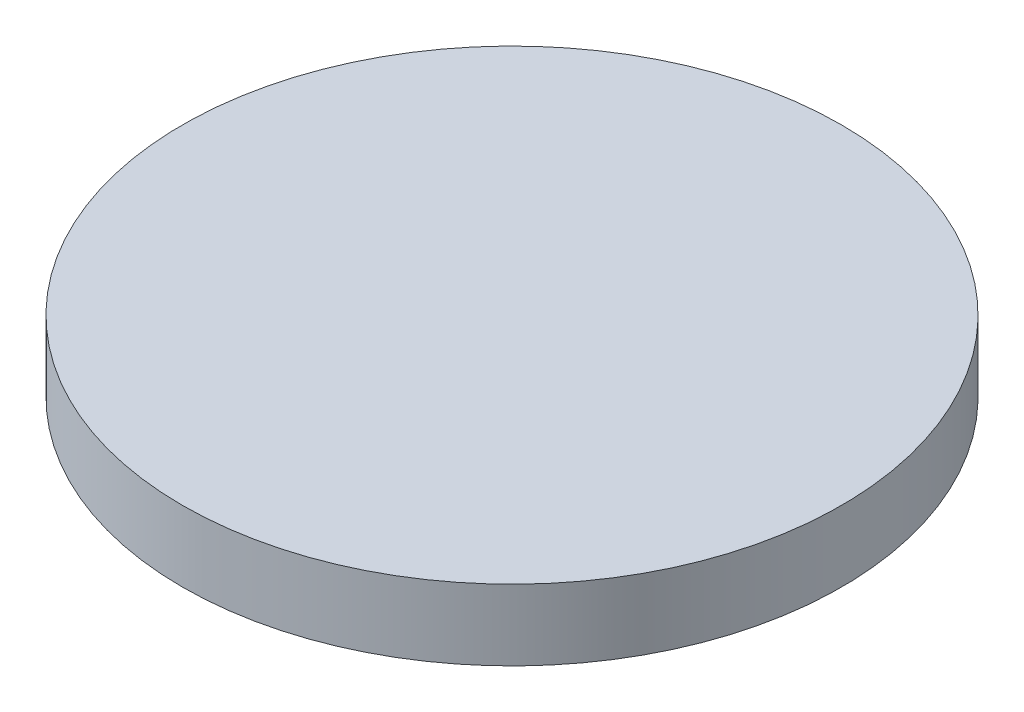
ISO-10303-21;
HEADER;
FILE_DESCRIPTION(('STEP AP214'),'2;1');
FILE_NAME('part.step','',(''),(''),'','','');
FILE_SCHEMA(('AUTOMOTIVE_DESIGN { 1 0 10303 214 1 1 1 1 }'));
ENDSEC;
DATA;
#1=APPLICATION_CONTEXT('core data for automotive mechanical design processes');
#2=APPLICATION_PROTOCOL_DEFINITION('international standard','automotive_design',2000,#1);
#3=PRODUCT_CONTEXT('',#1,'mechanical');
#4=PRODUCT('Part','Part','',(#3));
#5=PRODUCT_RELATED_PRODUCT_CATEGORY('part','',(#4));
#6=PRODUCT_DEFINITION_FORMATION('','',#4);
#7=PRODUCT_DEFINITION_CONTEXT('part definition',#1,'design');
#8=PRODUCT_DEFINITION('design','',#6,#7);
#9=PRODUCT_DEFINITION_SHAPE('','',#8);
#10=(LENGTH_UNIT() NAMED_UNIT(*) SI_UNIT(.MILLI.,.METRE.));
#11=(NAMED_UNIT(*) PLANE_ANGLE_UNIT() SI_UNIT($,.RADIAN.));
#12=(NAMED_UNIT(*) SI_UNIT($,.STERADIAN.) SOLID_ANGLE_UNIT());
#13=UNCERTAINTY_MEASURE_WITH_UNIT(LENGTH_MEASURE(1.E-05),#10,'distance_accuracy_value','');
#14=(GEOMETRIC_REPRESENTATION_CONTEXT(3) GLOBAL_UNCERTAINTY_ASSIGNED_CONTEXT((#13)) GLOBAL_UNIT_ASSIGNED_CONTEXT((#10,
#11,#12)) REPRESENTATION_CONTEXT('',''));
#15=CARTESIAN_POINT('',(0.,0.,0.));
#16=DIRECTION('',(0.,0.,1.));
#17=DIRECTION('',(1.,0.,0.));
#18=AXIS2_PLACEMENT_3D('',#15,#16,#17);
#19=CARTESIAN_POINT('',(0.,0.,0.));
#20=DIRECTION('',(0.,1.,0.));
#21=DIRECTION('',(0.,0.,1.));
#22=AXIS2_PLACEMENT_3D('',#19,#20,#21);
#23=PLANE('',#22);
#24=CARTESIAN_POINT('',(0.,0.,0.));
#25=DIRECTION('',(0.,1.,0.));
#26=DIRECTION('',(0.,0.,1.));
#27=AXIS2_PLACEMENT_3D('',#24,#25,#26);
#28=CIRCLE('',#27,41.89709041917);
#29=CARTESIAN_POINT('',(0.,0.,-41.89709041917));
#30=VERTEX_POINT('',#29);
#31=EDGE_CURVE('E10',#30,#30,#28,.T.);
#32=ORIENTED_EDGE('',*,*,#31,.F.);
#33=EDGE_LOOP('',(#32));
#34=FACE_BOUND('',#33,.T.);
#35=CARTESIAN_POINT('',(0.,0.,0.));
#36=DIRECTION('',(0.,1.,0.));
#37=DIRECTION('',(0.,0.,1.));
#38=AXIS2_PLACEMENT_3D('',#35,#36,#37);
#39=CIRCLE('',#38,39.8970904191699);
#40=CARTESIAN_POINT('',(0.,0.,-39.8970904191699));
#41=VERTEX_POINT('',#40);
#42=EDGE_CURVE('E38',#41,#41,#39,.T.);
#43=ORIENTED_EDGE('',*,*,#42,.T.);
#44=EDGE_LOOP('',(#43));
#45=FACE_BOUND('',#44,.T.);
#46=ADVANCED_FACE('F31',(#34,#45),#23,.F.);
#47=CARTESIAN_POINT('',(0.,7.,0.));
#48=DIRECTION('',(0.,-1.,0.));
#49=DIRECTION('',(0.,0.,-1.));
#50=AXIS2_PLACEMENT_3D('',#47,#48,#49);
#51=CYLINDRICAL_SURFACE('',#50,41.89709041917);
#52=CARTESIAN_POINT('',(0.,9.,0.));
#53=DIRECTION('',(0.,1.,0.));
#54=DIRECTION('',(0.,0.,1.));
#55=AXIS2_PLACEMENT_3D('',#52,#53,#54);
#56=CIRCLE('',#55,41.89709041917);
#57=CARTESIAN_POINT('',(0.,9.,-41.89709041917));
#58=VERTEX_POINT('',#57);
#59=EDGE_CURVE('E46',#58,#58,#56,.T.);
#60=CARTESIAN_POINT('',(0.,0.,-41.89709041917));
#61=CARTESIAN_POINT('',(0.,0.0937499999999992,-41.89709041917));
#62=CARTESIAN_POINT('',(0.,0.187499999999999,-41.89709041917));
#63=CARTESIAN_POINT('',(0.,0.374999999999999,-41.89709041917));
#64=CARTESIAN_POINT('',(0.,0.46875,-41.89709041917));
#65=CARTESIAN_POINT('',(0.,0.656249999999999,-41.89709041917));
#66=CARTESIAN_POINT('',(0.,0.749999999999999,-41.89709041917));
#67=CARTESIAN_POINT('',(0.,0.937499999999999,-41.89709041917));
#68=CARTESIAN_POINT('',(0.,1.03125,-41.89709041917));
#69=CARTESIAN_POINT('',(0.,1.21875,-41.89709041917));
#70=CARTESIAN_POINT('',(0.,1.3125,-41.89709041917));
#71=CARTESIAN_POINT('',(0.,1.5,-41.89709041917));
#72=CARTESIAN_POINT('',(0.,1.59375,-41.89709041917));
#73=CARTESIAN_POINT('',(0.,1.78125,-41.89709041917));
#74=CARTESIAN_POINT('',(0.,1.875,-41.89709041917));
#75=CARTESIAN_POINT('',(0.,2.0625,-41.89709041917));
#76=CARTESIAN_POINT('',(0.,2.15625,-41.89709041917));
#77=CARTESIAN_POINT('',(0.,2.34375,-41.89709041917));
#78=CARTESIAN_POINT('',(0.,2.4375,-41.89709041917));
#79=CARTESIAN_POINT('',(0.,2.625,-41.89709041917));
#80=CARTESIAN_POINT('',(0.,2.71875,-41.89709041917));
#81=CARTESIAN_POINT('',(0.,2.90625,-41.89709041917));
#82=CARTESIAN_POINT('',(0.,3.,-41.89709041917));
#83=CARTESIAN_POINT('',(0.,3.1875,-41.89709041917));
#84=CARTESIAN_POINT('',(0.,3.28125,-41.89709041917));
#85=CARTESIAN_POINT('',(0.,3.46875,-41.89709041917));
#86=CARTESIAN_POINT('',(0.,3.5625,-41.89709041917));
#87=CARTESIAN_POINT('',(0.,3.75,-41.89709041917));
#88=CARTESIAN_POINT('',(0.,3.84375,-41.89709041917));
#89=CARTESIAN_POINT('',(0.,4.03125,-41.89709041917));
#90=CARTESIAN_POINT('',(0.,4.125,-41.89709041917));
#91=CARTESIAN_POINT('',(0.,4.3125,-41.89709041917));
#92=CARTESIAN_POINT('',(0.,4.40625,-41.89709041917));
#93=CARTESIAN_POINT('',(0.,4.59375,-41.89709041917));
#94=CARTESIAN_POINT('',(0.,4.6875,-41.89709041917));
#95=CARTESIAN_POINT('',(0.,4.875,-41.89709041917));
#96=CARTESIAN_POINT('',(0.,4.96875,-41.89709041917));
#97=CARTESIAN_POINT('',(0.,5.15625,-41.89709041917));
#98=CARTESIAN_POINT('',(0.,5.25,-41.89709041917));
#99=CARTESIAN_POINT('',(0.,5.4375,-41.89709041917));
#100=CARTESIAN_POINT('',(0.,5.53125,-41.89709041917));
#101=CARTESIAN_POINT('',(0.,5.71875,-41.89709041917));
#102=CARTESIAN_POINT('',(0.,5.8125,-41.89709041917));
#103=CARTESIAN_POINT('',(0.,6.,-41.89709041917));
#104=CARTESIAN_POINT('',(0.,6.09375,-41.89709041917));
#105=CARTESIAN_POINT('',(0.,6.28125,-41.89709041917));
#106=CARTESIAN_POINT('',(0.,6.375,-41.89709041917));
#107=CARTESIAN_POINT('',(0.,6.5625,-41.89709041917));
#108=CARTESIAN_POINT('',(0.,6.65625,-41.89709041917));
#109=CARTESIAN_POINT('',(0.,6.84375,-41.89709041917));
#110=CARTESIAN_POINT('',(0.,6.9375,-41.89709041917));
#111=CARTESIAN_POINT('',(0.,7.125,-41.89709041917));
#112=CARTESIAN_POINT('',(0.,7.21875,-41.89709041917));
#113=CARTESIAN_POINT('',(0.,7.40625,-41.89709041917));
#114=CARTESIAN_POINT('',(0.,7.5,-41.89709041917));
#115=CARTESIAN_POINT('',(0.,7.6875,-41.89709041917));
#116=CARTESIAN_POINT('',(0.,7.78125,-41.89709041917));
#117=CARTESIAN_POINT('',(0.,7.96875,-41.89709041917));
#118=CARTESIAN_POINT('',(0.,8.0625,-41.89709041917));
#119=CARTESIAN_POINT('',(0.,8.25,-41.89709041917));
#120=CARTESIAN_POINT('',(0.,8.34375,-41.89709041917));
#121=CARTESIAN_POINT('',(0.,8.53125,-41.89709041917));
#122=CARTESIAN_POINT('',(0.,8.625,-41.89709041917));
#123=CARTESIAN_POINT('',(0.,8.8125,-41.89709041917));
#124=CARTESIAN_POINT('',(0.,8.90625,-41.89709041917));
#125=CARTESIAN_POINT('',(0.,9.,-41.89709041917));
#126=B_SPLINE_CURVE_WITH_KNOTS('',3,(#60,#61,#62,#63,#64,#65,#66,#67,#68,#69,#70,#71,#72,#73,
#74,#75,#76,#77,#78,#79,#80,#81,#82,#83,#84,#85,#86,#87,#88,#89,#90,#91,#92,#93,#94,#95,#96,#97,
#98,#99,#100,#101,#102,#103,#104,#105,#106,#107,#108,#109,#110,#111,#112,#113,#114,#115,#116,
#117,#118,#119,#120,#121,#122,#123,#124,#125),.UNSPECIFIED.,.F.,.F.,(4,2,2,2,2,2,2,2,2,2,2,2,2,
2,2,2,2,2,2,2,2,2,2,2,2,2,2,2,2,2,2,2,4),(0.,0.28125,0.5625,0.84375,1.125,1.40625,1.6875,
1.96875,2.25,2.53125,2.8125,3.09375,3.375,3.65625,3.9375,4.21875,4.5,4.78125,5.0625,5.34375,
5.625,5.90625,6.1875,6.46875,6.75,7.03125,7.3125,7.59375,7.875,8.15625,8.4375,8.71875,9.),.UNSPECIFIED.);
#127=EDGE_CURVE('BSEAM33',#30,#58,#126,.T.);
#128=ORIENTED_EDGE('',*,*,#31,.T.);
#129=ORIENTED_EDGE('',*,*,#59,.F.);
#130=ORIENTED_EDGE('',*,*,#127,.T.);
#131=ORIENTED_EDGE('',*,*,#127,.F.);
#132=EDGE_LOOP('',(#128,#130,#129,#131));
#133=FACE_BOUND('',#132,.T.);
#134=ADVANCED_FACE('F33',(#133),#51,.T.);
#135=CARTESIAN_POINT('',(0.,7.,0.));
#136=DIRECTION('',(0.,-1.,0.));
#137=DIRECTION('',(0.,0.,-1.));
#138=AXIS2_PLACEMENT_3D('',#135,#136,#137);
#139=CYLINDRICAL_SURFACE('',#138,39.8970904191699);
#140=CARTESIAN_POINT('',(0.,7.,0.));
#141=DIRECTION('',(0.,1.,0.));
#142=DIRECTION('',(0.,0.,1.));
#143=AXIS2_PLACEMENT_3D('',#140,#141,#142);
#144=CIRCLE('',#143,39.8970904191699);
#145=CARTESIAN_POINT('',(0.,7.,-39.8970904191699));
#146=VERTEX_POINT('',#145);
#147=EDGE_CURVE('E42',#146,#146,#144,.T.);
#148=CARTESIAN_POINT('',(0.,7.,-39.8970904191699));
#149=CARTESIAN_POINT('',(0.,6.92708333333333,-39.8970904191699));
#150=CARTESIAN_POINT('',(0.,6.85416666666667,-39.8970904191699));
#151=CARTESIAN_POINT('',(0.,6.70833333333333,-39.8970904191699));
#152=CARTESIAN_POINT('',(0.,6.63541666666667,-39.8970904191699));
#153=CARTESIAN_POINT('',(0.,6.48958333333333,-39.8970904191699));
#154=CARTESIAN_POINT('',(0.,6.41666666666667,-39.8970904191699));
#155=CARTESIAN_POINT('',(0.,6.27083333333333,-39.8970904191699));
#156=CARTESIAN_POINT('',(0.,6.19791666666667,-39.8970904191699));
#157=CARTESIAN_POINT('',(0.,6.05208333333333,-39.8970904191699));
#158=CARTESIAN_POINT('',(0.,5.97916666666667,-39.8970904191699));
#159=CARTESIAN_POINT('',(0.,5.83333333333333,-39.8970904191699));
#160=CARTESIAN_POINT('',(0.,5.76041666666667,-39.8970904191699));
#161=CARTESIAN_POINT('',(0.,5.61458333333333,-39.8970904191699));
#162=CARTESIAN_POINT('',(0.,5.54166666666667,-39.8970904191699));
#163=CARTESIAN_POINT('',(0.,5.39583333333333,-39.8970904191699));
#164=CARTESIAN_POINT('',(0.,5.32291666666667,-39.8970904191699));
#165=CARTESIAN_POINT('',(0.,5.17708333333333,-39.8970904191699));
#166=CARTESIAN_POINT('',(0.,5.10416666666667,-39.8970904191699));
#167=CARTESIAN_POINT('',(0.,4.95833333333333,-39.8970904191699));
#168=CARTESIAN_POINT('',(0.,4.88541666666667,-39.8970904191699));
#169=CARTESIAN_POINT('',(0.,4.73958333333333,-39.8970904191699));
#170=CARTESIAN_POINT('',(0.,4.66666666666667,-39.8970904191699));
#171=CARTESIAN_POINT('',(0.,4.52083333333333,-39.8970904191699));
#172=CARTESIAN_POINT('',(0.,4.44791666666667,-39.8970904191699));
#173=CARTESIAN_POINT('',(0.,4.30208333333333,-39.8970904191699));
#174=CARTESIAN_POINT('',(0.,4.22916666666667,-39.8970904191699));
#175=CARTESIAN_POINT('',(0.,4.08333333333333,-39.8970904191699));
#176=CARTESIAN_POINT('',(0.,4.01041666666667,-39.8970904191699));
#177=CARTESIAN_POINT('',(0.,3.86458333333333,-39.8970904191699));
#178=CARTESIAN_POINT('',(0.,3.79166666666667,-39.8970904191699));
#179=CARTESIAN_POINT('',(0.,3.64583333333333,-39.8970904191699));
#180=CARTESIAN_POINT('',(0.,3.57291666666667,-39.8970904191699));
#181=CARTESIAN_POINT('',(0.,3.42708333333333,-39.8970904191699));
#182=CARTESIAN_POINT('',(0.,3.35416666666667,-39.8970904191699));
#183=CARTESIAN_POINT('',(0.,3.20833333333333,-39.8970904191699));
#184=CARTESIAN_POINT('',(0.,3.13541666666667,-39.8970904191699));
#185=CARTESIAN_POINT('',(0.,2.98958333333333,-39.8970904191699));
#186=CARTESIAN_POINT('',(0.,2.91666666666667,-39.8970904191699));
#187=CARTESIAN_POINT('',(0.,2.77083333333333,-39.8970904191699));
#188=CARTESIAN_POINT('',(0.,2.69791666666667,-39.8970904191699));
#189=CARTESIAN_POINT('',(0.,2.55208333333333,-39.8970904191699));
#190=CARTESIAN_POINT('',(0.,2.47916666666667,-39.8970904191699));
#191=CARTESIAN_POINT('',(0.,2.33333333333333,-39.8970904191699));
#192=CARTESIAN_POINT('',(0.,2.26041666666667,-39.8970904191699));
#193=CARTESIAN_POINT('',(0.,2.11458333333333,-39.8970904191699));
#194=CARTESIAN_POINT('',(0.,2.04166666666667,-39.8970904191699));
#195=CARTESIAN_POINT('',(0.,1.89583333333333,-39.8970904191699));
#196=CARTESIAN_POINT('',(0.,1.82291666666667,-39.8970904191699));
#197=CARTESIAN_POINT('',(0.,1.67708333333333,-39.8970904191699));
#198=CARTESIAN_POINT('',(0.,1.60416666666667,-39.8970904191699));
#199=CARTESIAN_POINT('',(0.,1.45833333333333,-39.8970904191699));
#200=CARTESIAN_POINT('',(0.,1.38541666666667,-39.8970904191699));
#201=CARTESIAN_POINT('',(0.,1.23958333333333,-39.8970904191699));
#202=CARTESIAN_POINT('',(0.,1.16666666666667,-39.8970904191699));
#203=CARTESIAN_POINT('',(0.,1.02083333333333,-39.8970904191699));
#204=CARTESIAN_POINT('',(0.,0.947916666666666,-39.8970904191699));
#205=CARTESIAN_POINT('',(0.,0.802083333333332,-39.8970904191699));
#206=CARTESIAN_POINT('',(0.,0.729166666666666,-39.8970904191699));
#207=CARTESIAN_POINT('',(0.,0.583333333333332,-39.8970904191699));
#208=CARTESIAN_POINT('',(0.,0.510416666666666,-39.8970904191699));
#209=CARTESIAN_POINT('',(0.,0.364583333333333,-39.8970904191699));
#210=CARTESIAN_POINT('',(0.,0.291666666666666,-39.8970904191699));
#211=CARTESIAN_POINT('',(0.,0.145833333333333,-39.8970904191699));
#212=CARTESIAN_POINT('',(0.,0.0729166666666657,-39.8970904191699));
#213=CARTESIAN_POINT('',(0.,0.,-39.8970904191699));
#214=B_SPLINE_CURVE_WITH_KNOTS('',3,(#148,#149,#150,#151,#152,#153,#154,#155,#156,#157,#158,
#159,#160,#161,#162,#163,#164,#165,#166,#167,#168,#169,#170,#171,#172,#173,#174,#175,#176,#177,
#178,#179,#180,#181,#182,#183,#184,#185,#186,#187,#188,#189,#190,#191,#192,#193,#194,#195,#196,
#197,#198,#199,#200,#201,#202,#203,#204,#205,#206,#207,#208,#209,#210,#211,#212,#213),
.UNSPECIFIED.,.F.,.F.,(4,2,2,2,2,2,2,2,2,2,2,2,2,2,2,2,2,2,2,2,2,2,2,2,2,2,2,2,2,2,2,2,4),(0.,
0.218749999999999,0.4375,0.65625,0.875,1.09375,1.3125,1.53125,1.75,1.96875,2.1875,2.40625,2.625,
2.84375,3.0625,3.28125,3.5,3.71875,3.9375,4.15625,4.375,4.59375,4.8125,5.03125,5.25,5.46875,
5.6875,5.90625,6.125,6.34375,6.5625,6.78125,7.),.UNSPECIFIED.);
#215=EDGE_CURVE('BSEAM55',#146,#41,#214,.T.);
#216=ORIENTED_EDGE('',*,*,#147,.T.);
#217=ORIENTED_EDGE('',*,*,#42,.F.);
#218=ORIENTED_EDGE('',*,*,#215,.T.);
#219=ORIENTED_EDGE('',*,*,#215,.F.);
#220=EDGE_LOOP('',(#216,#218,#217,#219));
#221=FACE_BOUND('',#220,.T.);
#222=ADVANCED_FACE('F55',(#221),#139,.F.);
#223=CARTESIAN_POINT('',(0.,7.,0.));
#224=DIRECTION('',(0.,1.,0.));
#225=DIRECTION('',(0.,0.,1.));
#226=AXIS2_PLACEMENT_3D('',#223,#224,#225);
#227=PLANE('',#226);
#228=ORIENTED_EDGE('',*,*,#147,.F.);
#229=EDGE_LOOP('',(#228));
#230=FACE_BOUND('',#229,.T.);
#231=ADVANCED_FACE('F60',(#230),#227,.F.);
#232=CARTESIAN_POINT('',(0.,9.,0.));
#233=DIRECTION('',(0.,1.,0.));
#234=DIRECTION('',(0.,0.,1.));
#235=AXIS2_PLACEMENT_3D('',#232,#233,#234);
#236=PLANE('',#235);
#237=ORIENTED_EDGE('',*,*,#59,.T.);
#238=EDGE_LOOP('',(#237));
#239=FACE_BOUND('',#238,.T.);
#240=ADVANCED_FACE('F52',(#239),#236,.T.);
#241=CLOSED_SHELL('',(#46,#134,#222,#231,#240));
#242=MANIFOLD_SOLID_BREP('B2',#241);
#243=ADVANCED_BREP_SHAPE_REPRESENTATION('',(#18,#242),#14);
#244=SHAPE_DEFINITION_REPRESENTATION(#9,#243);
ENDSEC;
END-ISO-10303-21;
